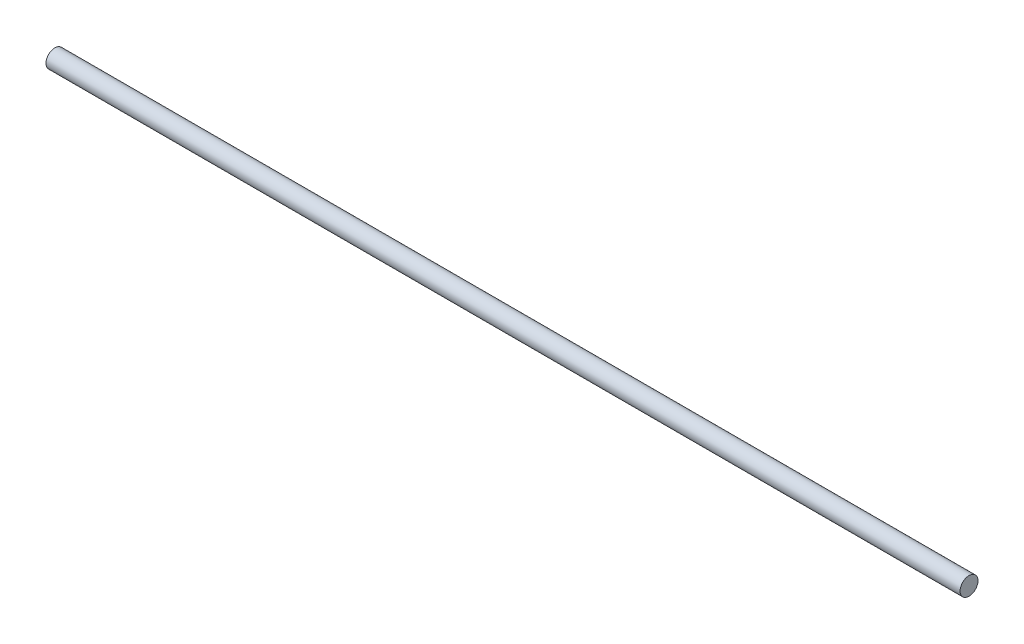
ISO-10303-21;
HEADER;
FILE_DESCRIPTION(('STEP AP214'),'2;1');
FILE_NAME('part.step','',(''),(''),'','','');
FILE_SCHEMA(('AUTOMOTIVE_DESIGN { 1 0 10303 214 1 1 1 1 }'));
ENDSEC;
DATA;
#1=APPLICATION_CONTEXT('core data for automotive mechanical design processes');
#2=APPLICATION_PROTOCOL_DEFINITION('international standard','automotive_design',2000,#1);
#3=PRODUCT_CONTEXT('',#1,'mechanical');
#4=PRODUCT('Part','Part','',(#3));
#5=PRODUCT_RELATED_PRODUCT_CATEGORY('part','',(#4));
#6=PRODUCT_DEFINITION_FORMATION('','',#4);
#7=PRODUCT_DEFINITION_CONTEXT('part definition',#1,'design');
#8=PRODUCT_DEFINITION('design','',#6,#7);
#9=PRODUCT_DEFINITION_SHAPE('','',#8);
#10=(LENGTH_UNIT() NAMED_UNIT(*) SI_UNIT(.MILLI.,.METRE.));
#11=(NAMED_UNIT(*) PLANE_ANGLE_UNIT() SI_UNIT($,.RADIAN.));
#12=(NAMED_UNIT(*) SI_UNIT($,.STERADIAN.) SOLID_ANGLE_UNIT());
#13=UNCERTAINTY_MEASURE_WITH_UNIT(LENGTH_MEASURE(1.E-05),#10,'distance_accuracy_value','');
#14=(GEOMETRIC_REPRESENTATION_CONTEXT(3) GLOBAL_UNCERTAINTY_ASSIGNED_CONTEXT((#13)) GLOBAL_UNIT_ASSIGNED_CONTEXT((#10,
#11,#12)) REPRESENTATION_CONTEXT('',''));
#15=CARTESIAN_POINT('',(0.,0.,0.));
#16=DIRECTION('',(0.,0.,1.));
#17=DIRECTION('',(1.,0.,0.));
#18=AXIS2_PLACEMENT_3D('',#15,#16,#17);
#19=CARTESIAN_POINT('',(510.,0.,0.));
#20=DIRECTION('',(-1.,0.,0.));
#21=DIRECTION('',(0.,0.,1.));
#22=AXIS2_PLACEMENT_3D('',#19,#20,#21);
#23=CYLINDRICAL_SURFACE('',#22,5.);
#24=CARTESIAN_POINT('',(510.,0.,0.));
#25=DIRECTION('',(1.,0.,0.));
#26=DIRECTION('',(0.,0.,-1.));
#27=AXIS2_PLACEMENT_3D('',#24,#25,#26);
#28=CIRCLE('',#27,5.);
#29=CARTESIAN_POINT('',(510.,0.,-5.));
#30=VERTEX_POINT('',#29);
#31=EDGE_CURVE('E10',#30,#30,#28,.T.);
#32=ORIENTED_EDGE('',*,*,#31,.F.);
#33=EDGE_LOOP('',(#32));
#34=FACE_BOUND('',#33,.T.);
#35=CARTESIAN_POINT('',(0.,0.,0.));
#36=DIRECTION('',(1.,0.,0.));
#37=DIRECTION('',(0.,0.,-1.));
#38=AXIS2_PLACEMENT_3D('',#35,#36,#37);
#39=CIRCLE('',#38,5.);
#40=CARTESIAN_POINT('',(0.,0.,-5.));
#41=VERTEX_POINT('',#40);
#42=EDGE_CURVE('E36',#41,#41,#39,.T.);
#43=ORIENTED_EDGE('',*,*,#42,.T.);
#44=EDGE_LOOP('',(#43));
#45=FACE_BOUND('',#44,.T.);
#46=ADVANCED_FACE('F33',(#34,#45),#23,.T.);
#47=CARTESIAN_POINT('',(510.,0.,0.));
#48=DIRECTION('',(1.,0.,0.));
#49=DIRECTION('',(0.,0.,-1.));
#50=AXIS2_PLACEMENT_3D('',#47,#48,#49);
#51=PLANE('',#50);
#52=ORIENTED_EDGE('',*,*,#31,.T.);
#53=EDGE_LOOP('',(#52));
#54=FACE_BOUND('',#53,.T.);
#55=ADVANCED_FACE('F48',(#54),#51,.T.);
#56=CARTESIAN_POINT('',(0.,0.,0.));
#57=DIRECTION('',(1.,0.,0.));
#58=DIRECTION('',(0.,0.,-1.));
#59=AXIS2_PLACEMENT_3D('',#56,#57,#58);
#60=PLANE('',#59);
#61=ORIENTED_EDGE('',*,*,#42,.F.);
#62=EDGE_LOOP('',(#61));
#63=FACE_BOUND('',#62,.T.);
#64=ADVANCED_FACE('F46',(#63),#60,.F.);
#65=CLOSED_SHELL('',(#46,#55,#64));
#66=MANIFOLD_SOLID_BREP('B2',#65);
#67=ADVANCED_BREP_SHAPE_REPRESENTATION('',(#18,#66),#14);
#68=SHAPE_DEFINITION_REPRESENTATION(#9,#67);
ENDSEC;
END-ISO-10303-21;
